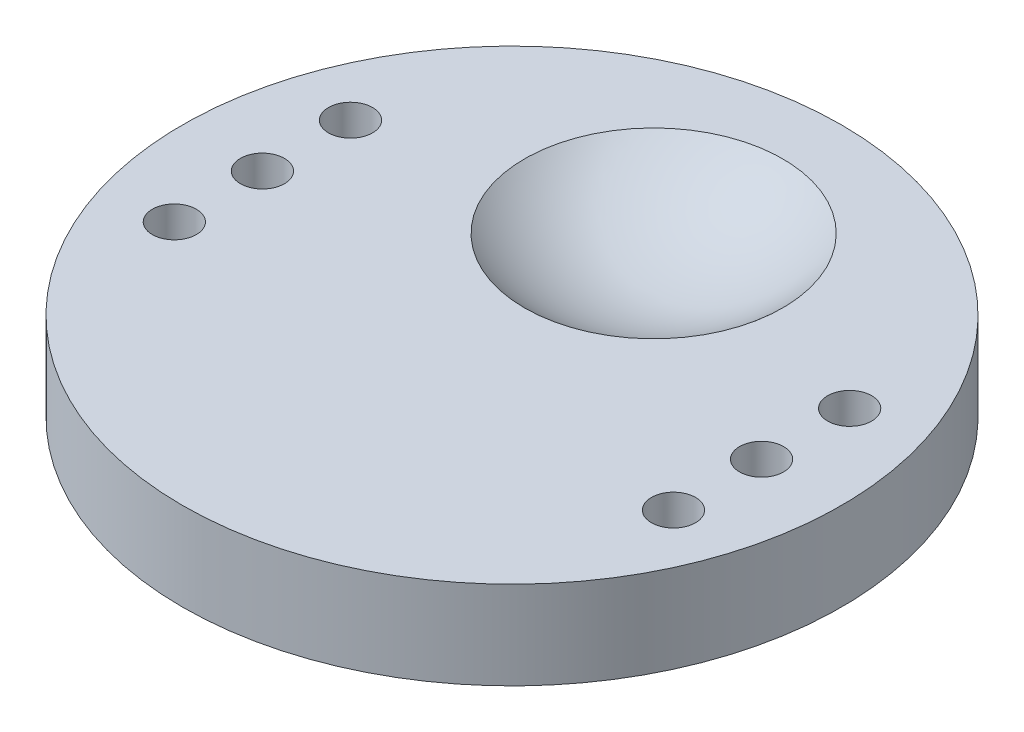
ISO-10303-21;
HEADER;
FILE_DESCRIPTION(('STEP AP214'),'2;1');
FILE_NAME('part.step','',(''),(''),'','','');
FILE_SCHEMA(('AUTOMOTIVE_DESIGN { 1 0 10303 214 1 1 1 1 }'));
ENDSEC;
DATA;
#1=APPLICATION_CONTEXT('core data for automotive mechanical design processes');
#2=APPLICATION_PROTOCOL_DEFINITION('international standard','automotive_design',2000,#1);
#3=PRODUCT_CONTEXT('',#1,'mechanical');
#4=PRODUCT('Part','Part','',(#3));
#5=PRODUCT_RELATED_PRODUCT_CATEGORY('part','',(#4));
#6=PRODUCT_DEFINITION_FORMATION('','',#4);
#7=PRODUCT_DEFINITION_CONTEXT('part definition',#1,'design');
#8=PRODUCT_DEFINITION('design','',#6,#7);
#9=PRODUCT_DEFINITION_SHAPE('','',#8);
#10=(LENGTH_UNIT() NAMED_UNIT(*) SI_UNIT(.MILLI.,.METRE.));
#11=(NAMED_UNIT(*) PLANE_ANGLE_UNIT() SI_UNIT($,.RADIAN.));
#12=(NAMED_UNIT(*) SI_UNIT($,.STERADIAN.) SOLID_ANGLE_UNIT());
#13=UNCERTAINTY_MEASURE_WITH_UNIT(LENGTH_MEASURE(1.E-05),#10,'distance_accuracy_value','');
#14=(GEOMETRIC_REPRESENTATION_CONTEXT(3) GLOBAL_UNCERTAINTY_ASSIGNED_CONTEXT((#13)) GLOBAL_UNIT_ASSIGNED_CONTEXT((#10,
#11,#12)) REPRESENTATION_CONTEXT('',''));
#15=CARTESIAN_POINT('',(0.,0.,0.));
#16=DIRECTION('',(0.,0.,1.));
#17=DIRECTION('',(1.,0.,0.));
#18=AXIS2_PLACEMENT_3D('',#15,#16,#17);
#19=CARTESIAN_POINT('',(0.,10.,0.));
#20=DIRECTION('',(0.,1.,0.));
#21=DIRECTION('',(0.,0.,1.));
#22=AXIS2_PLACEMENT_3D('',#19,#20,#21);
#23=PLANE('',#22);
#24=CARTESIAN_POINT('',(0.,10.,-16.0792));
#25=DIRECTION('',(0.,1.,0.));
#26=DIRECTION('',(0.,0.,1.));
#27=AXIS2_PLACEMENT_3D('',#24,#25,#26);
#28=CIRCLE('',#27,14.6605670081344);
#29=CARTESIAN_POINT('',(0.,10.,-1.41863299186557));
#30=VERTEX_POINT('',#29);
#31=EDGE_CURVE('E41',#30,#30,#28,.T.);
#32=ORIENTED_EDGE('',*,*,#31,.F.);
#33=EDGE_LOOP('',(#32));
#34=FACE_BOUND('',#33,.T.);
#35=CARTESIAN_POINT('',(28.335,10.,10.));
#36=DIRECTION('',(0.,1.,0.));
#37=DIRECTION('',(0.,0.,-1.));
#38=AXIS2_PLACEMENT_3D('',#35,#36,#37);
#39=CIRCLE('',#38,2.5);
#40=CARTESIAN_POINT('',(28.335,10.,7.5));
#41=VERTEX_POINT('',#40);
#42=EDGE_CURVE('E75',#41,#41,#39,.T.);
#43=ORIENTED_EDGE('',*,*,#42,.F.);
#44=EDGE_LOOP('',(#43));
#45=FACE_BOUND('',#44,.T.);
#46=CARTESIAN_POINT('',(-28.335,10.,-10.));
#47=DIRECTION('',(0.,1.,0.));
#48=DIRECTION('',(0.,0.,1.));
#49=AXIS2_PLACEMENT_3D('',#46,#47,#48);
#50=CIRCLE('',#49,2.5);
#51=CARTESIAN_POINT('',(-28.335,10.,-7.5));
#52=VERTEX_POINT('',#51);
#53=EDGE_CURVE('E62',#52,#52,#50,.T.);
#54=ORIENTED_EDGE('',*,*,#53,.F.);
#55=EDGE_LOOP('',(#54));
#56=FACE_BOUND('',#55,.T.);
#57=CARTESIAN_POINT('',(-28.335,10.,0.));
#58=DIRECTION('',(0.,1.,0.));
#59=DIRECTION('',(0.,0.,1.));
#60=AXIS2_PLACEMENT_3D('',#57,#58,#59);
#61=CIRCLE('',#60,2.5);
#62=CARTESIAN_POINT('',(-28.335,10.,2.5));
#63=VERTEX_POINT('',#62);
#64=EDGE_CURVE('E49',#63,#63,#61,.T.);
#65=ORIENTED_EDGE('',*,*,#64,.F.);
#66=EDGE_LOOP('',(#65));
#67=FACE_BOUND('',#66,.T.);
#68=CARTESIAN_POINT('',(0.,10.,0.));
#69=DIRECTION('',(0.,1.,0.));
#70=DIRECTION('',(0.,0.,1.));
#71=AXIS2_PLACEMENT_3D('',#68,#69,#70);
#72=CIRCLE('',#71,37.4142);
#73=CARTESIAN_POINT('',(0.,10.,37.4142));
#74=VERTEX_POINT('',#73);
#75=EDGE_CURVE('E10',#74,#74,#72,.T.);
#76=ORIENTED_EDGE('',*,*,#75,.T.);
#77=EDGE_LOOP('',(#76));
#78=FACE_BOUND('',#77,.T.);
#79=CARTESIAN_POINT('',(28.335,10.,0.));
#80=DIRECTION('',(0.,1.,0.));
#81=DIRECTION('',(0.,0.,-1.));
#82=AXIS2_PLACEMENT_3D('',#79,#80,#81);
#83=CIRCLE('',#82,2.5);
#84=CARTESIAN_POINT('',(28.335,10.,-2.5));
#85=VERTEX_POINT('',#84);
#86=EDGE_CURVE('E54',#85,#85,#83,.T.);
#87=ORIENTED_EDGE('',*,*,#86,.F.);
#88=EDGE_LOOP('',(#87));
#89=FACE_BOUND('',#88,.T.);
#90=CARTESIAN_POINT('',(-28.335,10.,10.));
#91=DIRECTION('',(0.,1.,0.));
#92=DIRECTION('',(0.,0.,1.));
#93=AXIS2_PLACEMENT_3D('',#90,#91,#92);
#94=CIRCLE('',#93,2.5);
#95=CARTESIAN_POINT('',(-28.335,10.,12.5));
#96=VERTEX_POINT('',#95);
#97=EDGE_CURVE('E70',#96,#96,#94,.T.);
#98=ORIENTED_EDGE('',*,*,#97,.F.);
#99=EDGE_LOOP('',(#98));
#100=FACE_BOUND('',#99,.T.);
#101=CARTESIAN_POINT('',(28.335,10.,-10.));
#102=DIRECTION('',(0.,1.,0.));
#103=DIRECTION('',(0.,0.,-1.));
#104=AXIS2_PLACEMENT_3D('',#101,#102,#103);
#105=CIRCLE('',#104,2.5);
#106=CARTESIAN_POINT('',(28.335,10.,-12.5));
#107=VERTEX_POINT('',#106);
#108=EDGE_CURVE('E79',#107,#107,#105,.T.);
#109=ORIENTED_EDGE('',*,*,#108,.F.);
#110=EDGE_LOOP('',(#109));
#111=FACE_BOUND('',#110,.T.);
#112=ADVANCED_FACE('F40',(#34,#45,#56,#67,#78,#89,#100,#111),#23,.T.);
#113=CARTESIAN_POINT('',(0.,0.,0.));
#114=DIRECTION('',(0.,1.,0.));
#115=DIRECTION('',(0.,0.,1.));
#116=AXIS2_PLACEMENT_3D('',#113,#114,#115);
#117=PLANE('',#116);
#118=CARTESIAN_POINT('',(0.,0.,0.));
#119=DIRECTION('',(0.,1.,0.));
#120=DIRECTION('',(0.,0.,1.));
#121=AXIS2_PLACEMENT_3D('',#118,#119,#120);
#122=CIRCLE('',#121,37.4142);
#123=CARTESIAN_POINT('',(0.,0.,37.4142));
#124=VERTEX_POINT('',#123);
#125=EDGE_CURVE('E44',#124,#124,#122,.T.);
#126=ORIENTED_EDGE('',*,*,#125,.F.);
#127=EDGE_LOOP('',(#126));
#128=FACE_BOUND('',#127,.T.);
#129=CARTESIAN_POINT('',(-28.335,0.,0.));
#130=DIRECTION('',(0.,1.,0.));
#131=DIRECTION('',(0.,0.,1.));
#132=AXIS2_PLACEMENT_3D('',#129,#130,#131);
#133=CIRCLE('',#132,2.5);
#134=CARTESIAN_POINT('',(-28.335,0.,2.5));
#135=VERTEX_POINT('',#134);
#136=EDGE_CURVE('E55',#135,#135,#133,.T.);
#137=ORIENTED_EDGE('',*,*,#136,.T.);
#138=EDGE_LOOP('',(#137));
#139=FACE_BOUND('',#138,.T.);
#140=CARTESIAN_POINT('',(28.335,0.,0.));
#141=DIRECTION('',(0.,1.,0.));
#142=DIRECTION('',(0.,0.,-1.));
#143=AXIS2_PLACEMENT_3D('',#140,#141,#142);
#144=CIRCLE('',#143,2.5);
#145=CARTESIAN_POINT('',(28.335,0.,-2.5));
#146=VERTEX_POINT('',#145);
#147=EDGE_CURVE('E59',#146,#146,#144,.T.);
#148=ORIENTED_EDGE('',*,*,#147,.T.);
#149=EDGE_LOOP('',(#148));
#150=FACE_BOUND('',#149,.T.);
#151=CARTESIAN_POINT('',(-28.335,0.,-10.));
#152=DIRECTION('',(0.,1.,0.));
#153=DIRECTION('',(0.,0.,1.));
#154=AXIS2_PLACEMENT_3D('',#151,#152,#153);
#155=CIRCLE('',#154,2.5);
#156=CARTESIAN_POINT('',(-28.335,0.,-7.5));
#157=VERTEX_POINT('',#156);
#158=EDGE_CURVE('E61',#157,#157,#155,.T.);
#159=ORIENTED_EDGE('',*,*,#158,.T.);
#160=EDGE_LOOP('',(#159));
#161=FACE_BOUND('',#160,.T.);
#162=CARTESIAN_POINT('',(-28.335,0.,10.));
#163=DIRECTION('',(0.,1.,0.));
#164=DIRECTION('',(0.,0.,1.));
#165=AXIS2_PLACEMENT_3D('',#162,#163,#164);
#166=CIRCLE('',#165,2.5);
#167=CARTESIAN_POINT('',(-28.335,0.,12.5));
#168=VERTEX_POINT('',#167);
#169=EDGE_CURVE('E69',#168,#168,#166,.T.);
#170=ORIENTED_EDGE('',*,*,#169,.T.);
#171=EDGE_LOOP('',(#170));
#172=FACE_BOUND('',#171,.T.);
#173=CARTESIAN_POINT('',(28.335,0.,10.));
#174=DIRECTION('',(0.,1.,0.));
#175=DIRECTION('',(0.,0.,-1.));
#176=AXIS2_PLACEMENT_3D('',#173,#174,#175);
#177=CIRCLE('',#176,2.5);
#178=CARTESIAN_POINT('',(28.335,0.,7.5));
#179=VERTEX_POINT('',#178);
#180=EDGE_CURVE('E77',#179,#179,#177,.T.);
#181=ORIENTED_EDGE('',*,*,#180,.T.);
#182=EDGE_LOOP('',(#181));
#183=FACE_BOUND('',#182,.T.);
#184=CARTESIAN_POINT('',(28.335,0.,-10.));
#185=DIRECTION('',(0.,1.,0.));
#186=DIRECTION('',(0.,0.,-1.));
#187=AXIS2_PLACEMENT_3D('',#184,#185,#186);
#188=CIRCLE('',#187,2.5);
#189=CARTESIAN_POINT('',(28.335,0.,-12.5));
#190=VERTEX_POINT('',#189);
#191=EDGE_CURVE('E85',#190,#190,#188,.T.);
#192=ORIENTED_EDGE('',*,*,#191,.T.);
#193=EDGE_LOOP('',(#192));
#194=FACE_BOUND('',#193,.T.);
#195=ADVANCED_FACE('F91',(#128,#139,#150,#161,#172,#183,#194),#117,.F.);
#196=CARTESIAN_POINT('',(0.,10.,0.));
#197=DIRECTION('',(0.,-1.,0.));
#198=DIRECTION('',(0.,0.,-1.));
#199=AXIS2_PLACEMENT_3D('',#196,#197,#198);
#200=CYLINDRICAL_SURFACE('',#199,37.4142);
#201=ORIENTED_EDGE('',*,*,#75,.F.);
#202=EDGE_LOOP('',(#201));
#203=FACE_BOUND('',#202,.T.);
#204=ORIENTED_EDGE('',*,*,#125,.T.);
#205=EDGE_LOOP('',(#204));
#206=FACE_BOUND('',#205,.T.);
#207=ADVANCED_FACE('F39',(#203,#206),#200,.T.);
#208=CARTESIAN_POINT('',(-28.335,10.,0.));
#209=DIRECTION('',(0.,-1.,0.));
#210=DIRECTION('',(0.,0.,-1.));
#211=AXIS2_PLACEMENT_3D('',#208,#209,#210);
#212=CYLINDRICAL_SURFACE('',#211,2.5);
#213=ORIENTED_EDGE('',*,*,#64,.T.);
#214=EDGE_LOOP('',(#213));
#215=FACE_BOUND('',#214,.T.);
#216=ORIENTED_EDGE('',*,*,#136,.F.);
#217=EDGE_LOOP('',(#216));
#218=FACE_BOUND('',#217,.T.);
#219=ADVANCED_FACE('F104',(#215,#218),#212,.F.);
#220=CARTESIAN_POINT('',(28.335,10.,0.));
#221=DIRECTION('',(0.,-1.,0.));
#222=DIRECTION('',(0.,0.,-1.));
#223=AXIS2_PLACEMENT_3D('',#220,#221,#222);
#224=CYLINDRICAL_SURFACE('',#223,2.5);
#225=ORIENTED_EDGE('',*,*,#86,.T.);
#226=EDGE_LOOP('',(#225));
#227=FACE_BOUND('',#226,.T.);
#228=ORIENTED_EDGE('',*,*,#147,.F.);
#229=EDGE_LOOP('',(#228));
#230=FACE_BOUND('',#229,.T.);
#231=ADVANCED_FACE('F110',(#227,#230),#224,.F.);
#232=CARTESIAN_POINT('',(-28.335,10.,-10.));
#233=DIRECTION('',(0.,-1.,0.));
#234=DIRECTION('',(0.,0.,-1.));
#235=AXIS2_PLACEMENT_3D('',#232,#233,#234);
#236=CYLINDRICAL_SURFACE('',#235,2.5);
#237=ORIENTED_EDGE('',*,*,#53,.T.);
#238=EDGE_LOOP('',(#237));
#239=FACE_BOUND('',#238,.T.);
#240=ORIENTED_EDGE('',*,*,#158,.F.);
#241=EDGE_LOOP('',(#240));
#242=FACE_BOUND('',#241,.T.);
#243=ADVANCED_FACE('F111',(#239,#242),#236,.F.);
#244=CARTESIAN_POINT('',(-28.335,10.,10.));
#245=DIRECTION('',(0.,-1.,0.));
#246=DIRECTION('',(0.,0.,-1.));
#247=AXIS2_PLACEMENT_3D('',#244,#245,#246);
#248=CYLINDRICAL_SURFACE('',#247,2.5);
#249=ORIENTED_EDGE('',*,*,#97,.T.);
#250=EDGE_LOOP('',(#249));
#251=FACE_BOUND('',#250,.T.);
#252=ORIENTED_EDGE('',*,*,#169,.F.);
#253=EDGE_LOOP('',(#252));
#254=FACE_BOUND('',#253,.T.);
#255=ADVANCED_FACE('F114',(#251,#254),#248,.F.);
#256=CARTESIAN_POINT('',(28.335,10.,10.));
#257=DIRECTION('',(0.,-1.,0.));
#258=DIRECTION('',(0.,0.,-1.));
#259=AXIS2_PLACEMENT_3D('',#256,#257,#258);
#260=CYLINDRICAL_SURFACE('',#259,2.5);
#261=ORIENTED_EDGE('',*,*,#42,.T.);
#262=EDGE_LOOP('',(#261));
#263=FACE_BOUND('',#262,.T.);
#264=ORIENTED_EDGE('',*,*,#180,.F.);
#265=EDGE_LOOP('',(#264));
#266=FACE_BOUND('',#265,.T.);
#267=ADVANCED_FACE('F118',(#263,#266),#260,.F.);
#268=CARTESIAN_POINT('',(28.335,10.,-10.));
#269=DIRECTION('',(0.,-1.,0.));
#270=DIRECTION('',(0.,0.,-1.));
#271=AXIS2_PLACEMENT_3D('',#268,#269,#270);
#272=CYLINDRICAL_SURFACE('',#271,2.5);
#273=ORIENTED_EDGE('',*,*,#108,.T.);
#274=EDGE_LOOP('',(#273));
#275=FACE_BOUND('',#274,.T.);
#276=ORIENTED_EDGE('',*,*,#191,.F.);
#277=EDGE_LOOP('',(#276));
#278=FACE_BOUND('',#277,.T.);
#279=ADVANCED_FACE('F87',(#275,#278),#272,.F.);
#280=CARTESIAN_POINT('',(0.,25.5,-16.0792));
#281=DIRECTION('',(0.,-1.,0.));
#282=DIRECTION('',(0.,0.,1.));
#283=AXIS2_PLACEMENT_3D('',#280,#281,#282);
#284=SPHERICAL_SURFACE('',#283,21.335);
#285=ORIENTED_EDGE('',*,*,#31,.T.);
#286=EDGE_LOOP('',(#285));
#287=FACE_BOUND('',#286,.T.);
#288=ADVANCED_FACE('F123',(#287),#284,.F.);
#289=CLOSED_SHELL('',(#112,#195,#207,#219,#231,#243,#255,#267,#279,#288));
#290=MANIFOLD_SOLID_BREP('B2',#289);
#291=ADVANCED_BREP_SHAPE_REPRESENTATION('',(#18,#290),#14);
#292=SHAPE_DEFINITION_REPRESENTATION(#9,#291);
ENDSEC;
END-ISO-10303-21;
